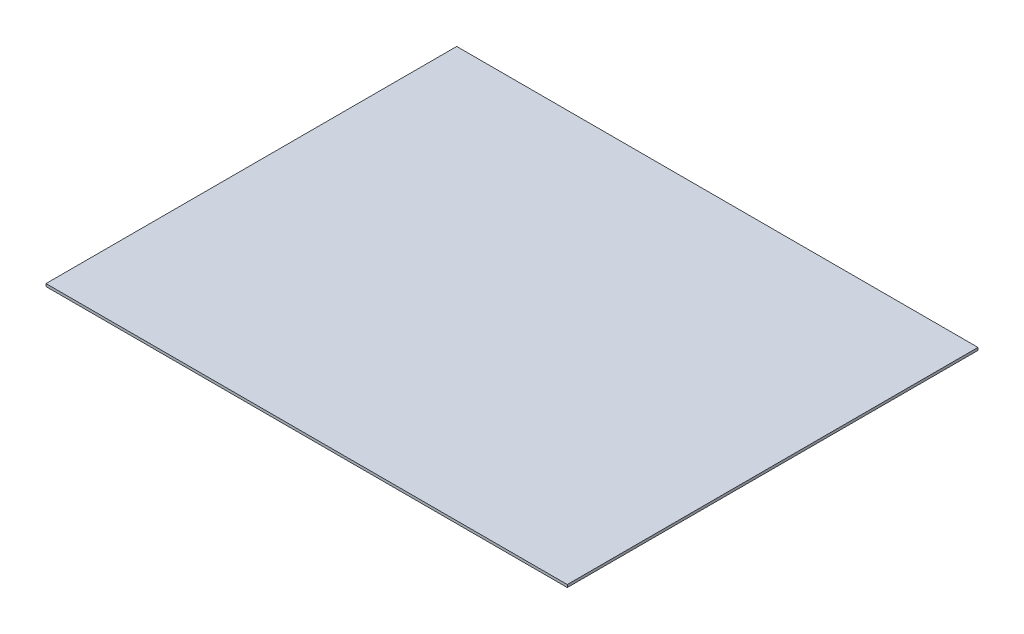
ISO-10303-21;
HEADER;
FILE_DESCRIPTION(('STEP AP214'),'2;1');
FILE_NAME('part.step','',(''),(''),'','','');
FILE_SCHEMA(('AUTOMOTIVE_DESIGN { 1 0 10303 214 1 1 1 1 }'));
ENDSEC;
DATA;
#1=APPLICATION_CONTEXT('core data for automotive mechanical design processes');
#2=APPLICATION_PROTOCOL_DEFINITION('international standard','automotive_design',2000,#1);
#3=PRODUCT_CONTEXT('',#1,'mechanical');
#4=PRODUCT('Part','Part','',(#3));
#5=PRODUCT_RELATED_PRODUCT_CATEGORY('part','',(#4));
#6=PRODUCT_DEFINITION_FORMATION('','',#4);
#7=PRODUCT_DEFINITION_CONTEXT('part definition',#1,'design');
#8=PRODUCT_DEFINITION('design','',#6,#7);
#9=PRODUCT_DEFINITION_SHAPE('','',#8);
#10=(LENGTH_UNIT() NAMED_UNIT(*) SI_UNIT(.MILLI.,.METRE.));
#11=(NAMED_UNIT(*) PLANE_ANGLE_UNIT() SI_UNIT($,.RADIAN.));
#12=(NAMED_UNIT(*) SI_UNIT($,.STERADIAN.) SOLID_ANGLE_UNIT());
#13=UNCERTAINTY_MEASURE_WITH_UNIT(LENGTH_MEASURE(1.E-05),#10,'distance_accuracy_value','');
#14=(GEOMETRIC_REPRESENTATION_CONTEXT(3) GLOBAL_UNCERTAINTY_ASSIGNED_CONTEXT((#13)) GLOBAL_UNIT_ASSIGNED_CONTEXT((#10,
#11,#12)) REPRESENTATION_CONTEXT('',''));
#15=CARTESIAN_POINT('',(0.,0.,0.));
#16=DIRECTION('',(0.,0.,1.));
#17=DIRECTION('',(1.,0.,0.));
#18=AXIS2_PLACEMENT_3D('',#15,#16,#17);
#19=CARTESIAN_POINT('',(495.,-5.,390.));
#20=DIRECTION('',(1.,0.,0.));
#21=DIRECTION('',(0.,0.,-1.));
#22=AXIS2_PLACEMENT_3D('',#19,#20,#21);
#23=PLANE('',#22);
#24=DIRECTION('',(0.,0.,-1.));
#25=VECTOR('',#24,1.);
#26=CARTESIAN_POINT('',(495.,0.,390.));
#27=LINE('',#26,#25);
#28=CARTESIAN_POINT('',(495.,0.,390.));
#29=VERTEX_POINT('',#28);
#30=CARTESIAN_POINT('',(495.,0.,-390.));
#31=VERTEX_POINT('',#30);
#32=EDGE_CURVE('E81',#29,#31,#27,.T.);
#33=ORIENTED_EDGE('',*,*,#32,.F.);
#34=DIRECTION('',(0.,1.,0.));
#35=VECTOR('',#34,1.);
#36=CARTESIAN_POINT('',(495.,-5.,390.));
#37=LINE('',#36,#35);
#38=CARTESIAN_POINT('',(495.,-5.,390.));
#39=VERTEX_POINT('',#38);
#40=EDGE_CURVE('E11',#39,#29,#37,.T.);
#41=ORIENTED_EDGE('',*,*,#40,.F.);
#42=DIRECTION('',(0.,0.,-1.));
#43=VECTOR('',#42,1.);
#44=CARTESIAN_POINT('',(495.,-5.,390.));
#45=LINE('',#44,#43);
#46=CARTESIAN_POINT('',(495.,-5.,-390.));
#47=VERTEX_POINT('',#46);
#48=EDGE_CURVE('E75',#39,#47,#45,.T.);
#49=ORIENTED_EDGE('',*,*,#48,.T.);
#50=DIRECTION('',(0.,1.,0.));
#51=VECTOR('',#50,1.);
#52=CARTESIAN_POINT('',(495.,-5.,-390.));
#53=LINE('',#52,#51);
#54=EDGE_CURVE('E20',#47,#31,#53,.T.);
#55=ORIENTED_EDGE('',*,*,#54,.T.);
#56=EDGE_LOOP('',(#33,#41,#49,#55));
#57=FACE_BOUND('',#56,.T.);
#58=ADVANCED_FACE('F17',(#57),#23,.T.);
#59=CARTESIAN_POINT('',(-495.,-5.,390.));
#60=DIRECTION('',(0.,0.,1.));
#61=DIRECTION('',(1.,0.,0.));
#62=AXIS2_PLACEMENT_3D('',#59,#60,#61);
#63=PLANE('',#62);
#64=DIRECTION('',(1.,0.,0.));
#65=VECTOR('',#64,1.);
#66=CARTESIAN_POINT('',(-495.,0.,390.));
#67=LINE('',#66,#65);
#68=CARTESIAN_POINT('',(-495.,0.,390.));
#69=VERTEX_POINT('',#68);
#70=EDGE_CURVE('E77',#69,#29,#67,.T.);
#71=ORIENTED_EDGE('',*,*,#70,.F.);
#72=DIRECTION('',(0.,1.,0.));
#73=VECTOR('',#72,1.);
#74=CARTESIAN_POINT('',(-495.,-5.,390.));
#75=LINE('',#74,#73);
#76=CARTESIAN_POINT('',(-495.,-5.,390.));
#77=VERTEX_POINT('',#76);
#78=EDGE_CURVE('E26',#77,#69,#75,.T.);
#79=ORIENTED_EDGE('',*,*,#78,.F.);
#80=DIRECTION('',(1.,0.,0.));
#81=VECTOR('',#80,1.);
#82=CARTESIAN_POINT('',(-495.,-5.,390.));
#83=LINE('',#82,#81);
#84=EDGE_CURVE('E72',#77,#39,#83,.T.);
#85=ORIENTED_EDGE('',*,*,#84,.T.);
#86=ORIENTED_EDGE('',*,*,#40,.T.);
#87=EDGE_LOOP('',(#71,#79,#85,#86));
#88=FACE_BOUND('',#87,.T.);
#89=ADVANCED_FACE('F91',(#88),#63,.T.);
#90=CARTESIAN_POINT('',(-495.,-5.,390.));
#91=DIRECTION('',(-1.,0.,0.));
#92=DIRECTION('',(0.,0.,1.));
#93=AXIS2_PLACEMENT_3D('',#90,#91,#92);
#94=PLANE('',#93);
#95=DIRECTION('',(0.,0.,1.));
#96=VECTOR('',#95,1.);
#97=CARTESIAN_POINT('',(-495.,0.,390.));
#98=LINE('',#97,#96);
#99=CARTESIAN_POINT('',(-495.,0.,-390.));
#100=VERTEX_POINT('',#99);
#101=EDGE_CURVE('E67',#100,#69,#98,.T.);
#102=ORIENTED_EDGE('',*,*,#101,.F.);
#103=DIRECTION('',(0.,1.,0.));
#104=VECTOR('',#103,1.);
#105=CARTESIAN_POINT('',(-495.,-5.,-390.));
#106=LINE('',#105,#104);
#107=CARTESIAN_POINT('',(-495.,-5.,-390.));
#108=VERTEX_POINT('',#107);
#109=EDGE_CURVE('E62',#108,#100,#106,.T.);
#110=ORIENTED_EDGE('',*,*,#109,.F.);
#111=DIRECTION('',(0.,0.,1.));
#112=VECTOR('',#111,1.);
#113=CARTESIAN_POINT('',(-495.,-5.,390.));
#114=LINE('',#113,#112);
#115=EDGE_CURVE('E65',#108,#77,#114,.T.);
#116=ORIENTED_EDGE('',*,*,#115,.T.);
#117=ORIENTED_EDGE('',*,*,#78,.T.);
#118=EDGE_LOOP('',(#102,#110,#116,#117));
#119=FACE_BOUND('',#118,.T.);
#120=ADVANCED_FACE('F64',(#119),#94,.T.);
#121=CARTESIAN_POINT('',(-495.,-5.,-390.));
#122=DIRECTION('',(0.,0.,-1.));
#123=DIRECTION('',(-1.,0.,0.));
#124=AXIS2_PLACEMENT_3D('',#121,#122,#123);
#125=PLANE('',#124);
#126=DIRECTION('',(-1.,0.,0.));
#127=VECTOR('',#126,1.);
#128=CARTESIAN_POINT('',(-495.,0.,-390.));
#129=LINE('',#128,#127);
#130=EDGE_CURVE('E84',#31,#100,#129,.T.);
#131=ORIENTED_EDGE('',*,*,#130,.F.);
#132=ORIENTED_EDGE('',*,*,#54,.F.);
#133=DIRECTION('',(-1.,0.,0.));
#134=VECTOR('',#133,1.);
#135=CARTESIAN_POINT('',(-495.,-5.,-390.));
#136=LINE('',#135,#134);
#137=EDGE_CURVE('E71',#47,#108,#136,.T.);
#138=ORIENTED_EDGE('',*,*,#137,.T.);
#139=ORIENTED_EDGE('',*,*,#109,.T.);
#140=EDGE_LOOP('',(#131,#132,#138,#139));
#141=FACE_BOUND('',#140,.T.);
#142=ADVANCED_FACE('F74',(#141),#125,.T.);
#143=CARTESIAN_POINT('',(0.,-5.,0.));
#144=DIRECTION('',(0.,-1.,0.));
#145=DIRECTION('',(0.,0.,-1.));
#146=AXIS2_PLACEMENT_3D('',#143,#144,#145);
#147=PLANE('',#146);
#148=ORIENTED_EDGE('',*,*,#48,.F.);
#149=ORIENTED_EDGE('',*,*,#84,.F.);
#150=ORIENTED_EDGE('',*,*,#115,.F.);
#151=ORIENTED_EDGE('',*,*,#137,.F.);
#152=EDGE_LOOP('',(#148,#149,#150,#151));
#153=FACE_BOUND('',#152,.T.);
#154=ADVANCED_FACE('F70',(#153),#147,.T.);
#155=CARTESIAN_POINT('',(0.,0.,0.));
#156=DIRECTION('',(0.,-1.,0.));
#157=DIRECTION('',(0.,0.,-1.));
#158=AXIS2_PLACEMENT_3D('',#155,#156,#157);
#159=PLANE('',#158);
#160=ORIENTED_EDGE('',*,*,#32,.T.);
#161=ORIENTED_EDGE('',*,*,#130,.T.);
#162=ORIENTED_EDGE('',*,*,#101,.T.);
#163=ORIENTED_EDGE('',*,*,#70,.T.);
#164=EDGE_LOOP('',(#160,#161,#162,#163));
#165=FACE_BOUND('',#164,.T.);
#166=ADVANCED_FACE('F90',(#165),#159,.F.);
#167=CLOSED_SHELL('',(#58,#89,#120,#142,#154,#166));
#168=MANIFOLD_SOLID_BREP('B1',#167);
#169=ADVANCED_BREP_SHAPE_REPRESENTATION('',(#18,#168),#14);
#170=SHAPE_DEFINITION_REPRESENTATION(#9,#169);
ENDSEC;
END-ISO-10303-21;
